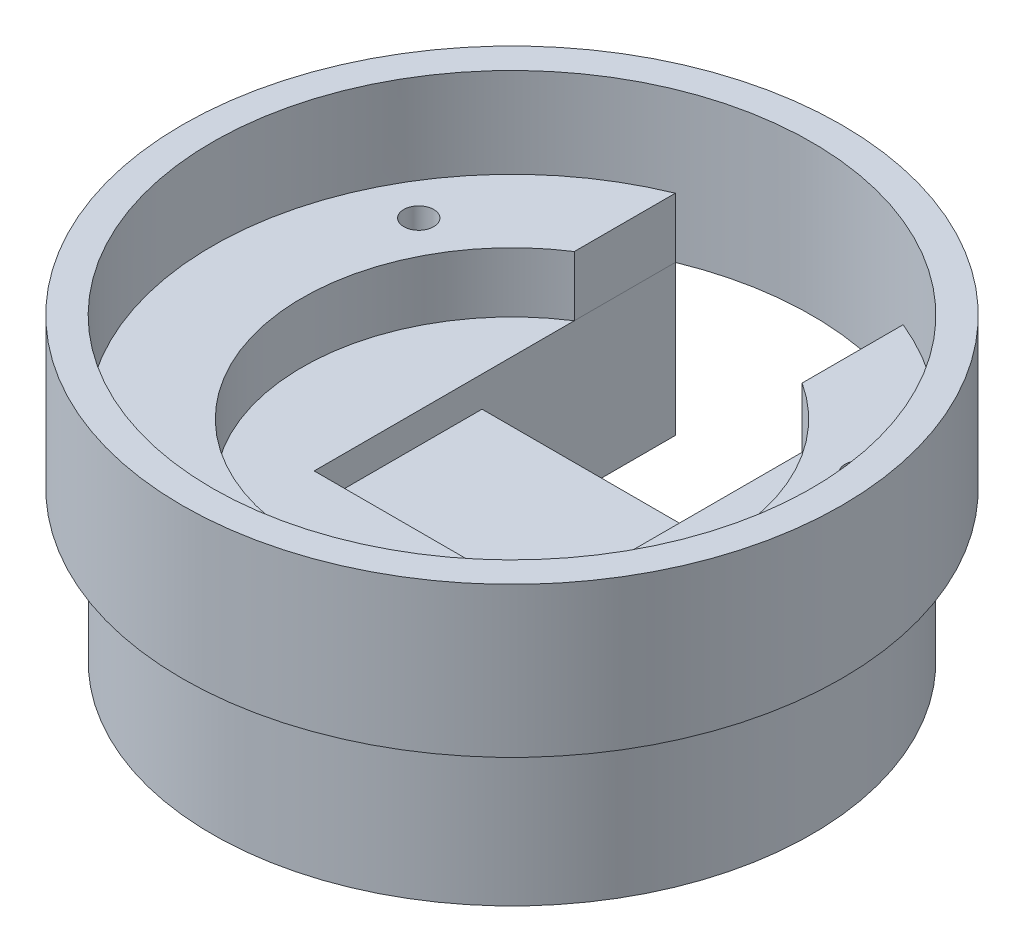
ISO-10303-21;
HEADER;
FILE_DESCRIPTION(('STEP AP214'),'2;1');
FILE_NAME('part.step','',(''),(''),'','','');
FILE_SCHEMA(('AUTOMOTIVE_DESIGN { 1 0 10303 214 1 1 1 1 }'));
ENDSEC;
DATA;
#1=APPLICATION_CONTEXT('core data for automotive mechanical design processes');
#2=APPLICATION_PROTOCOL_DEFINITION('international standard','automotive_design',2000,#1);
#3=PRODUCT_CONTEXT('',#1,'mechanical');
#4=PRODUCT('Part','Part','',(#3));
#5=PRODUCT_RELATED_PRODUCT_CATEGORY('part','',(#4));
#6=PRODUCT_DEFINITION_FORMATION('','',#4);
#7=PRODUCT_DEFINITION_CONTEXT('part definition',#1,'design');
#8=PRODUCT_DEFINITION('design','',#6,#7);
#9=PRODUCT_DEFINITION_SHAPE('','',#8);
#10=(LENGTH_UNIT() NAMED_UNIT(*) SI_UNIT(.MILLI.,.METRE.));
#11=(NAMED_UNIT(*) PLANE_ANGLE_UNIT() SI_UNIT($,.RADIAN.));
#12=(NAMED_UNIT(*) SI_UNIT($,.STERADIAN.) SOLID_ANGLE_UNIT());
#13=UNCERTAINTY_MEASURE_WITH_UNIT(LENGTH_MEASURE(1.E-05),#10,'distance_accuracy_value','');
#14=(GEOMETRIC_REPRESENTATION_CONTEXT(3) GLOBAL_UNCERTAINTY_ASSIGNED_CONTEXT((#13)) GLOBAL_UNIT_ASSIGNED_CONTEXT((#10,
#11,#12)) REPRESENTATION_CONTEXT('',''));
#15=CARTESIAN_POINT('',(0.,0.,0.));
#16=DIRECTION('',(0.,0.,1.));
#17=DIRECTION('',(1.,0.,0.));
#18=AXIS2_PLACEMENT_3D('',#15,#16,#17);
#19=CARTESIAN_POINT('',(0.,-12.5,0.));
#20=DIRECTION('',(0.,1.,0.));
#21=DIRECTION('',(0.,0.,1.));
#22=AXIS2_PLACEMENT_3D('',#19,#20,#21);
#23=CYLINDRICAL_SURFACE('',#22,25.);
#24=CARTESIAN_POINT('',(0.,0.,0.));
#25=DIRECTION('',(0.,-1.,0.));
#26=DIRECTION('',(0.,0.,-1.));
#27=AXIS2_PLACEMENT_3D('',#24,#25,#26);
#28=CIRCLE('',#27,25.);
#29=CARTESIAN_POINT('',(9.5,0.,-23.1246621596944));
#30=VERTEX_POINT('',#29);
#31=CARTESIAN_POINT('',(-9.5,0.,-23.1246621596944));
#32=VERTEX_POINT('',#31);
#33=EDGE_CURVE('E54',#30,#32,#28,.T.);
#34=ORIENTED_EDGE('',*,*,#33,.T.);
#35=DIRECTION('',(0.,1.,0.));
#36=VECTOR('',#35,1.);
#37=CARTESIAN_POINT('',(-9.5,-12.5,-23.1246621596944));
#38=LINE('',#37,#36);
#39=CARTESIAN_POINT('',(-9.5,-12.5,-23.1246621596944));
#40=VERTEX_POINT('',#39);
#41=EDGE_CURVE('E132',#32,#40,#38,.F.);
#42=ORIENTED_EDGE('',*,*,#41,.T.);
#43=CARTESIAN_POINT('',(0.,-12.5,0.));
#44=DIRECTION('',(0.,-1.,0.));
#45=DIRECTION('',(0.,0.,-1.));
#46=AXIS2_PLACEMENT_3D('',#43,#44,#45);
#47=CIRCLE('',#46,25.);
#48=CARTESIAN_POINT('',(9.5,-12.5,-23.1246621596944));
#49=VERTEX_POINT('',#48);
#50=EDGE_CURVE('E12',#49,#40,#47,.T.);
#51=ORIENTED_EDGE('',*,*,#50,.F.);
#52=DIRECTION('',(0.,1.,0.));
#53=VECTOR('',#52,1.);
#54=CARTESIAN_POINT('',(9.5,-12.5,-23.1246621596944));
#55=LINE('',#54,#53);
#56=EDGE_CURVE('E112',#49,#30,#55,.T.);
#57=ORIENTED_EDGE('',*,*,#56,.T.);
#58=EDGE_LOOP('',(#34,#42,#51,#57));
#59=FACE_BOUND('',#58,.T.);
#60=ADVANCED_FACE('F46',(#59),#23,.T.);
#61=CARTESIAN_POINT('',(0.,-12.5,0.));
#62=DIRECTION('',(0.,-1.,0.));
#63=DIRECTION('',(0.,0.,-1.));
#64=AXIS2_PLACEMENT_3D('',#61,#62,#63);
#65=PLANE('',#64);
#66=CARTESIAN_POINT('',(18.4030398304193,-12.5,-10.6250000000001));
#67=DIRECTION('',(0.,-1.,0.));
#68=DIRECTION('',(0.,0.,-1.));
#69=AXIS2_PLACEMENT_3D('',#66,#67,#68);
#70=CIRCLE('',#69,1.25);
#71=CARTESIAN_POINT('',(18.4030398304193,-12.5,-11.8750000000001));
#72=VERTEX_POINT('',#71);
#73=EDGE_CURVE('E167',#72,#72,#70,.F.);
#74=ORIENTED_EDGE('',*,*,#73,.T.);
#75=EDGE_LOOP('',(#74));
#76=FACE_BOUND('',#75,.T.);
#77=CARTESIAN_POINT('',(0.,-12.5,21.25));
#78=DIRECTION('',(0.,-1.,0.));
#79=DIRECTION('',(0.,0.,-1.));
#80=AXIS2_PLACEMENT_3D('',#77,#78,#79);
#81=CIRCLE('',#80,1.25);
#82=CARTESIAN_POINT('',(0.,-12.5,20.));
#83=VERTEX_POINT('',#82);
#84=EDGE_CURVE('E158',#83,#83,#81,.F.);
#85=ORIENTED_EDGE('',*,*,#84,.T.);
#86=EDGE_LOOP('',(#85));
#87=FACE_BOUND('',#86,.T.);
#88=CARTESIAN_POINT('',(-18.4030398304193,-12.5,-10.6250000000001));
#89=DIRECTION('',(0.,-1.,0.));
#90=DIRECTION('',(0.,0.,-1.));
#91=AXIS2_PLACEMENT_3D('',#88,#89,#90);
#92=CIRCLE('',#91,1.25);
#93=CARTESIAN_POINT('',(-18.4030398304193,-12.5,-11.8750000000001));
#94=VERTEX_POINT('',#93);
#95=EDGE_CURVE('E155',#94,#94,#92,.F.);
#96=ORIENTED_EDGE('',*,*,#95,.T.);
#97=EDGE_LOOP('',(#96));
#98=FACE_BOUND('',#97,.T.);
#99=DIRECTION('',(0.,0.,1.));
#100=VECTOR('',#99,1.);
#101=CARTESIAN_POINT('',(-9.5,-12.5,-7.));
#102=LINE('',#101,#100);
#103=CARTESIAN_POINT('',(-9.5,-12.5,-7.));
#104=VERTEX_POINT('',#103);
#105=EDGE_CURVE('E124',#40,#104,#102,.T.);
#106=ORIENTED_EDGE('',*,*,#105,.T.);
#107=DIRECTION('',(1.,0.,0.));
#108=VECTOR('',#107,1.);
#109=CARTESIAN_POINT('',(9.5,-12.5,-7.));
#110=LINE('',#109,#108);
#111=CARTESIAN_POINT('',(9.5,-12.5,-7.));
#112=VERTEX_POINT('',#111);
#113=EDGE_CURVE('E118',#104,#112,#110,.T.);
#114=ORIENTED_EDGE('',*,*,#113,.T.);
#115=DIRECTION('',(0.,0.,-1.));
#116=VECTOR('',#115,1.);
#117=CARTESIAN_POINT('',(9.5,-12.5,-7.));
#118=LINE('',#117,#116);
#119=EDGE_CURVE('E106',#112,#49,#118,.T.);
#120=ORIENTED_EDGE('',*,*,#119,.T.);
#121=ORIENTED_EDGE('',*,*,#50,.T.);
#122=EDGE_LOOP('',(#106,#114,#120,#121));
#123=FACE_BOUND('',#122,.T.);
#124=ADVANCED_FACE('F123',(#76,#87,#98,#123),#65,.T.);
#125=CARTESIAN_POINT('',(0.,0.,0.));
#126=DIRECTION('',(0.,-1.,0.));
#127=DIRECTION('',(0.,0.,-1.));
#128=AXIS2_PLACEMENT_3D('',#125,#126,#127);
#129=PLANE('',#128);
#130=CARTESIAN_POINT('',(18.4030398304193,0.,-10.6250000000001));
#131=DIRECTION('',(0.,-1.,0.));
#132=DIRECTION('',(0.,0.,-1.));
#133=AXIS2_PLACEMENT_3D('',#130,#131,#132);
#134=CIRCLE('',#133,1.25);
#135=CARTESIAN_POINT('',(18.4030398304193,0.,-11.8750000000001));
#136=VERTEX_POINT('',#135);
#137=EDGE_CURVE('E49',#136,#136,#134,.T.);
#138=ORIENTED_EDGE('',*,*,#137,.T.);
#139=EDGE_LOOP('',(#138));
#140=FACE_BOUND('',#139,.T.);
#141=CARTESIAN_POINT('',(0.,0.,21.25));
#142=DIRECTION('',(0.,-1.,0.));
#143=DIRECTION('',(0.,0.,-1.));
#144=AXIS2_PLACEMENT_3D('',#141,#142,#143);
#145=CIRCLE('',#144,1.25);
#146=CARTESIAN_POINT('',(0.,0.,20.));
#147=VERTEX_POINT('',#146);
#148=EDGE_CURVE('E156',#147,#147,#145,.T.);
#149=ORIENTED_EDGE('',*,*,#148,.T.);
#150=EDGE_LOOP('',(#149));
#151=FACE_BOUND('',#150,.T.);
#152=CARTESIAN_POINT('',(-18.4030398304193,0.,-10.6250000000001));
#153=DIRECTION('',(0.,-1.,0.));
#154=DIRECTION('',(0.,0.,-1.));
#155=AXIS2_PLACEMENT_3D('',#152,#153,#154);
#156=CIRCLE('',#155,1.25);
#157=CARTESIAN_POINT('',(-18.4030398304193,0.,-11.8750000000001));
#158=VERTEX_POINT('',#157);
#159=EDGE_CURVE('E129',#158,#158,#156,.T.);
#160=ORIENTED_EDGE('',*,*,#159,.T.);
#161=EDGE_LOOP('',(#160));
#162=FACE_BOUND('',#161,.T.);
#163=DIRECTION('',(0.,0.,1.));
#164=VECTOR('',#163,1.);
#165=CARTESIAN_POINT('',(-9.5,0.,-7.));
#166=LINE('',#165,#164);
#167=CARTESIAN_POINT('',(-9.5,0.,7.));
#168=VERTEX_POINT('',#167);
#169=EDGE_CURVE('E62',#32,#168,#166,.T.);
#170=ORIENTED_EDGE('',*,*,#169,.F.);
#171=ORIENTED_EDGE('',*,*,#33,.F.);
#172=DIRECTION('',(0.,0.,-1.));
#173=VECTOR('',#172,1.);
#174=CARTESIAN_POINT('',(9.5,0.,-7.));
#175=LINE('',#174,#173);
#176=CARTESIAN_POINT('',(9.5,0.,7.));
#177=VERTEX_POINT('',#176);
#178=EDGE_CURVE('E139',#177,#30,#175,.T.);
#179=ORIENTED_EDGE('',*,*,#178,.F.);
#180=DIRECTION('',(1.,0.,0.));
#181=VECTOR('',#180,1.);
#182=CARTESIAN_POINT('',(9.5,0.,7.));
#183=LINE('',#182,#181);
#184=EDGE_CURVE('E147',#168,#177,#183,.T.);
#185=ORIENTED_EDGE('',*,*,#184,.F.);
#186=EDGE_LOOP('',(#170,#171,#179,#185));
#187=FACE_BOUND('',#186,.T.);
#188=ADVANCED_FACE('F180',(#140,#151,#162,#187),#129,.F.);
#189=CARTESIAN_POINT('',(-9.5,-2.54,-7.));
#190=DIRECTION('',(-1.,0.,0.));
#191=DIRECTION('',(0.,0.,1.));
#192=AXIS2_PLACEMENT_3D('',#189,#190,#191);
#193=PLANE('',#192);
#194=ORIENTED_EDGE('',*,*,#169,.T.);
#195=DIRECTION('',(0.,1.,0.));
#196=VECTOR('',#195,1.);
#197=CARTESIAN_POINT('',(-9.5,-2.54,7.));
#198=LINE('',#197,#196);
#199=CARTESIAN_POINT('',(-9.5,-2.54,7.));
#200=VERTEX_POINT('',#199);
#201=EDGE_CURVE('E145',#200,#168,#198,.T.);
#202=ORIENTED_EDGE('',*,*,#201,.F.);
#203=DIRECTION('',(0.,0.,1.));
#204=VECTOR('',#203,1.);
#205=CARTESIAN_POINT('',(-9.5,-2.54,-7.));
#206=LINE('',#205,#204);
#207=CARTESIAN_POINT('',(-9.5,-2.54,-7.));
#208=VERTEX_POINT('',#207);
#209=EDGE_CURVE('E135',#208,#200,#206,.T.);
#210=ORIENTED_EDGE('',*,*,#209,.F.);
#211=DIRECTION('',(0.,1.,0.));
#212=VECTOR('',#211,1.);
#213=CARTESIAN_POINT('',(-9.5,-40.4508497187474,-7.));
#214=LINE('',#213,#212);
#215=EDGE_CURVE('E71',#104,#208,#214,.T.);
#216=ORIENTED_EDGE('',*,*,#215,.F.);
#217=ORIENTED_EDGE('',*,*,#105,.F.);
#218=ORIENTED_EDGE('',*,*,#41,.F.);
#219=EDGE_LOOP('',(#194,#202,#210,#216,#217,#218));
#220=FACE_BOUND('',#219,.T.);
#221=ADVANCED_FACE('F182',(#220),#193,.F.);
#222=CARTESIAN_POINT('',(9.5,-2.54,-7.));
#223=DIRECTION('',(1.,0.,0.));
#224=DIRECTION('',(0.,0.,-1.));
#225=AXIS2_PLACEMENT_3D('',#222,#223,#224);
#226=PLANE('',#225);
#227=ORIENTED_EDGE('',*,*,#178,.T.);
#228=ORIENTED_EDGE('',*,*,#56,.F.);
#229=ORIENTED_EDGE('',*,*,#119,.F.);
#230=DIRECTION('',(0.,1.,0.));
#231=VECTOR('',#230,1.);
#232=CARTESIAN_POINT('',(9.5,-40.4508497187474,-7.));
#233=LINE('',#232,#231);
#234=CARTESIAN_POINT('',(9.5,-2.54,-7.));
#235=VERTEX_POINT('',#234);
#236=EDGE_CURVE('E109',#112,#235,#233,.T.);
#237=ORIENTED_EDGE('',*,*,#236,.T.);
#238=DIRECTION('',(0.,0.,-1.));
#239=VECTOR('',#238,1.);
#240=CARTESIAN_POINT('',(9.5,-2.54,-7.));
#241=LINE('',#240,#239);
#242=CARTESIAN_POINT('',(9.5,-2.54,7.));
#243=VERTEX_POINT('',#242);
#244=EDGE_CURVE('E142',#243,#235,#241,.T.);
#245=ORIENTED_EDGE('',*,*,#244,.F.);
#246=DIRECTION('',(0.,1.,0.));
#247=VECTOR('',#246,1.);
#248=CARTESIAN_POINT('',(9.5,-2.54,7.));
#249=LINE('',#248,#247);
#250=EDGE_CURVE('E83',#243,#177,#249,.T.);
#251=ORIENTED_EDGE('',*,*,#250,.T.);
#252=EDGE_LOOP('',(#227,#228,#229,#237,#245,#251));
#253=FACE_BOUND('',#252,.T.);
#254=ADVANCED_FACE('F108',(#253),#226,.F.);
#255=CARTESIAN_POINT('',(9.5,-2.54,7.));
#256=DIRECTION('',(0.,0.,1.));
#257=DIRECTION('',(1.,0.,0.));
#258=AXIS2_PLACEMENT_3D('',#255,#256,#257);
#259=PLANE('',#258);
#260=ORIENTED_EDGE('',*,*,#184,.T.);
#261=ORIENTED_EDGE('',*,*,#250,.F.);
#262=DIRECTION('',(1.,0.,0.));
#263=VECTOR('',#262,1.);
#264=CARTESIAN_POINT('',(9.5,-2.54,7.));
#265=LINE('',#264,#263);
#266=EDGE_CURVE('E138',#200,#243,#265,.T.);
#267=ORIENTED_EDGE('',*,*,#266,.F.);
#268=ORIENTED_EDGE('',*,*,#201,.T.);
#269=EDGE_LOOP('',(#260,#261,#267,#268));
#270=FACE_BOUND('',#269,.T.);
#271=ADVANCED_FACE('F207',(#270),#259,.F.);
#272=CARTESIAN_POINT('',(0.,-2.54,0.));
#273=DIRECTION('',(0.,-1.,0.));
#274=DIRECTION('',(0.,0.,-1.));
#275=AXIS2_PLACEMENT_3D('',#272,#273,#274);
#276=PLANE('',#275);
#277=ORIENTED_EDGE('',*,*,#209,.T.);
#278=ORIENTED_EDGE('',*,*,#266,.T.);
#279=ORIENTED_EDGE('',*,*,#244,.T.);
#280=DIRECTION('',(-1.,0.,0.));
#281=VECTOR('',#280,1.);
#282=CARTESIAN_POINT('',(9.5,-2.54,-7.));
#283=LINE('',#282,#281);
#284=EDGE_CURVE('E120',#235,#208,#283,.T.);
#285=ORIENTED_EDGE('',*,*,#284,.T.);
#286=EDGE_LOOP('',(#277,#278,#279,#285));
#287=FACE_BOUND('',#286,.T.);
#288=ADVANCED_FACE('F196',(#287),#276,.F.);
#289=CARTESIAN_POINT('',(9.5,-40.4508497187474,-7.));
#290=DIRECTION('',(0.,0.,1.));
#291=DIRECTION('',(1.,0.,0.));
#292=AXIS2_PLACEMENT_3D('',#289,#290,#291);
#293=PLANE('',#292);
#294=ORIENTED_EDGE('',*,*,#236,.F.);
#295=ORIENTED_EDGE('',*,*,#113,.F.);
#296=ORIENTED_EDGE('',*,*,#215,.T.);
#297=ORIENTED_EDGE('',*,*,#284,.F.);
#298=EDGE_LOOP('',(#294,#295,#296,#297));
#299=FACE_BOUND('',#298,.T.);
#300=ADVANCED_FACE('F117',(#299),#293,.F.);
#301=CARTESIAN_POINT('',(-18.4030398304193,5.,-10.6250000000001));
#302=DIRECTION('',(0.,1.,0.));
#303=DIRECTION('',(0.,0.,1.));
#304=AXIS2_PLACEMENT_3D('',#301,#302,#303);
#305=CYLINDRICAL_SURFACE('',#304,1.25);
#306=ORIENTED_EDGE('',*,*,#95,.F.);
#307=EDGE_LOOP('',(#306));
#308=FACE_BOUND('',#307,.T.);
#309=ORIENTED_EDGE('',*,*,#159,.F.);
#310=EDGE_LOOP('',(#309));
#311=FACE_BOUND('',#310,.T.);
#312=ADVANCED_FACE('F186',(#308,#311),#305,.F.);
#313=CARTESIAN_POINT('',(0.,5.,21.25));
#314=DIRECTION('',(0.,1.,0.));
#315=DIRECTION('',(0.,0.,1.));
#316=AXIS2_PLACEMENT_3D('',#313,#314,#315);
#317=CYLINDRICAL_SURFACE('',#316,1.25);
#318=ORIENTED_EDGE('',*,*,#84,.F.);
#319=EDGE_LOOP('',(#318));
#320=FACE_BOUND('',#319,.T.);
#321=ORIENTED_EDGE('',*,*,#148,.F.);
#322=EDGE_LOOP('',(#321));
#323=FACE_BOUND('',#322,.T.);
#324=ADVANCED_FACE('F176',(#320,#323),#317,.F.);
#325=CARTESIAN_POINT('',(18.4030398304193,5.,-10.6250000000001));
#326=DIRECTION('',(0.,1.,0.));
#327=DIRECTION('',(0.,0.,1.));
#328=AXIS2_PLACEMENT_3D('',#325,#326,#327);
#329=CYLINDRICAL_SURFACE('',#328,1.25);
#330=ORIENTED_EDGE('',*,*,#73,.F.);
#331=EDGE_LOOP('',(#330));
#332=FACE_BOUND('',#331,.T.);
#333=ORIENTED_EDGE('',*,*,#137,.F.);
#334=EDGE_LOOP('',(#333));
#335=FACE_BOUND('',#334,.T.);
#336=ADVANCED_FACE('F173',(#332,#335),#329,.F.);
#337=CLOSED_SHELL('',(#60,#124,#188,#221,#254,#271,#288,#300,#312,#324,#336));
#338=MANIFOLD_SOLID_BREP('B2',#337);
#339=CARTESIAN_POINT('',(0.,0.,0.));
#340=DIRECTION('',(0.,1.,0.));
#341=DIRECTION('',(0.,0.,1.));
#342=AXIS2_PLACEMENT_3D('',#339,#340,#341);
#343=PLANE('',#342);
#344=CARTESIAN_POINT('',(18.4030398304193,0.,-10.6250000000001));
#345=DIRECTION('',(0.,1.,0.));
#346=DIRECTION('',(0.,0.,1.));
#347=AXIS2_PLACEMENT_3D('',#344,#345,#346);
#348=CIRCLE('',#347,1.25);
#349=CARTESIAN_POINT('',(18.4030398304193,0.,-9.3750000000001));
#350=VERTEX_POINT('',#349);
#351=EDGE_CURVE('E476',#350,#350,#348,.T.);
#352=ORIENTED_EDGE('',*,*,#351,.T.);
#353=EDGE_LOOP('',(#352));
#354=FACE_BOUND('',#353,.T.);
#355=CARTESIAN_POINT('',(0.,0.,21.25));
#356=DIRECTION('',(0.,1.,0.));
#357=DIRECTION('',(0.,0.,1.));
#358=AXIS2_PLACEMENT_3D('',#355,#356,#357);
#359=CIRCLE('',#358,1.25);
#360=CARTESIAN_POINT('',(0.,0.,22.5));
#361=VERTEX_POINT('',#360);
#362=EDGE_CURVE('E480',#361,#361,#359,.T.);
#363=ORIENTED_EDGE('',*,*,#362,.T.);
#364=EDGE_LOOP('',(#363));
#365=FACE_BOUND('',#364,.T.);
#366=CARTESIAN_POINT('',(-18.4030398304193,0.,-10.6250000000001));
#367=DIRECTION('',(0.,1.,0.));
#368=DIRECTION('',(0.,0.,1.));
#369=AXIS2_PLACEMENT_3D('',#366,#367,#368);
#370=CIRCLE('',#369,1.25);
#371=CARTESIAN_POINT('',(-18.4030398304193,0.,-9.37500000000009));
#372=VERTEX_POINT('',#371);
#373=EDGE_CURVE('E339',#372,#372,#370,.T.);
#374=ORIENTED_EDGE('',*,*,#373,.T.);
#375=EDGE_LOOP('',(#374));
#376=FACE_BOUND('',#375,.T.);
#377=CARTESIAN_POINT('',(0.,0.,0.));
#378=DIRECTION('',(0.,1.,0.));
#379=DIRECTION('',(0.,0.,1.));
#380=AXIS2_PLACEMENT_3D('',#377,#378,#379);
#381=CIRCLE('',#380,27.5);
#382=CARTESIAN_POINT('',(0.,0.,27.5));
#383=VERTEX_POINT('',#382);
#384=EDGE_CURVE('E356',#383,#383,#381,.T.);
#385=ORIENTED_EDGE('',*,*,#384,.F.);
#386=EDGE_LOOP('',(#385));
#387=FACE_BOUND('',#386,.T.);
#388=DIRECTION('',(0.,0.,1.));
#389=VECTOR('',#388,1.);
#390=CARTESIAN_POINT('',(-9.5,0.,-14.6969384566991));
#391=LINE('',#390,#389);
#392=CARTESIAN_POINT('',(-9.5,0.,-23.1246621596944));
#393=VERTEX_POINT('',#392);
#394=CARTESIAN_POINT('',(-9.5,0.,-14.6969384566991));
#395=VERTEX_POINT('',#394);
#396=EDGE_CURVE('E313',#393,#395,#391,.T.);
#397=ORIENTED_EDGE('',*,*,#396,.T.);
#398=CARTESIAN_POINT('',(0.,0.,0.));
#399=DIRECTION('',(0.,1.,0.));
#400=DIRECTION('',(0.,0.,1.));
#401=AXIS2_PLACEMENT_3D('',#398,#399,#400);
#402=CIRCLE('',#401,17.5);
#403=CARTESIAN_POINT('',(9.5,0.,-14.6969384566991));
#404=VERTEX_POINT('',#403);
#405=EDGE_CURVE('E347',#395,#404,#402,.T.);
#406=ORIENTED_EDGE('',*,*,#405,.T.);
#407=DIRECTION('',(0.,0.,1.));
#408=VECTOR('',#407,1.);
#409=CARTESIAN_POINT('',(9.5,0.,-14.6969384566991));
#410=LINE('',#409,#408);
#411=CARTESIAN_POINT('',(9.5,0.,-23.1246621596944));
#412=VERTEX_POINT('',#411);
#413=EDGE_CURVE('E305',#412,#404,#410,.T.);
#414=ORIENTED_EDGE('',*,*,#413,.F.);
#415=CARTESIAN_POINT('',(0.,0.,0.));
#416=DIRECTION('',(0.,1.,0.));
#417=DIRECTION('',(0.,0.,1.));
#418=AXIS2_PLACEMENT_3D('',#415,#416,#417);
#419=CIRCLE('',#418,25.);
#420=EDGE_CURVE('E348',#393,#412,#419,.F.);
#421=ORIENTED_EDGE('',*,*,#420,.F.);
#422=EDGE_LOOP('',(#397,#406,#414,#421));
#423=FACE_BOUND('',#422,.T.);
#424=ADVANCED_FACE('F290',(#354,#365,#376,#387,#423),#343,.F.);
#425=CARTESIAN_POINT('',(0.,5.,0.));
#426=DIRECTION('',(0.,1.,0.));
#427=DIRECTION('',(0.,0.,1.));
#428=AXIS2_PLACEMENT_3D('',#425,#426,#427);
#429=PLANE('',#428);
#430=CARTESIAN_POINT('',(18.4030398304193,5.,-10.6250000000001));
#431=DIRECTION('',(0.,1.,0.));
#432=DIRECTION('',(0.,0.,1.));
#433=AXIS2_PLACEMENT_3D('',#430,#431,#432);
#434=CIRCLE('',#433,1.25);
#435=CARTESIAN_POINT('',(18.4030398304193,5.,-9.3750000000001));
#436=VERTEX_POINT('',#435);
#437=EDGE_CURVE('E473',#436,#436,#434,.T.);
#438=ORIENTED_EDGE('',*,*,#437,.F.);
#439=EDGE_LOOP('',(#438));
#440=FACE_BOUND('',#439,.T.);
#441=CARTESIAN_POINT('',(0.,5.,21.25));
#442=DIRECTION('',(0.,1.,0.));
#443=DIRECTION('',(0.,0.,1.));
#444=AXIS2_PLACEMENT_3D('',#441,#442,#443);
#445=CIRCLE('',#444,1.25);
#446=CARTESIAN_POINT('',(0.,5.,22.5));
#447=VERTEX_POINT('',#446);
#448=EDGE_CURVE('E477',#447,#447,#445,.T.);
#449=ORIENTED_EDGE('',*,*,#448,.F.);
#450=EDGE_LOOP('',(#449));
#451=FACE_BOUND('',#450,.T.);
#452=CARTESIAN_POINT('',(-18.4030398304193,5.,-10.6250000000001));
#453=DIRECTION('',(0.,1.,0.));
#454=DIRECTION('',(0.,0.,1.));
#455=AXIS2_PLACEMENT_3D('',#452,#453,#454);
#456=CIRCLE('',#455,1.25);
#457=CARTESIAN_POINT('',(-18.4030398304193,5.,-9.37500000000009));
#458=VERTEX_POINT('',#457);
#459=EDGE_CURVE('E486',#458,#458,#456,.T.);
#460=ORIENTED_EDGE('',*,*,#459,.F.);
#461=EDGE_LOOP('',(#460));
#462=FACE_BOUND('',#461,.T.);
#463=CARTESIAN_POINT('',(0.,5.,0.));
#464=DIRECTION('',(0.,1.,0.));
#465=DIRECTION('',(0.,0.,1.));
#466=AXIS2_PLACEMENT_3D('',#463,#464,#465);
#467=CIRCLE('',#466,17.5);
#468=CARTESIAN_POINT('',(-9.5,5.,-14.6969384566991));
#469=VERTEX_POINT('',#468);
#470=CARTESIAN_POINT('',(9.5,5.,-14.6969384566991));
#471=VERTEX_POINT('',#470);
#472=EDGE_CURVE('E345',#469,#471,#467,.T.);
#473=ORIENTED_EDGE('',*,*,#472,.F.);
#474=DIRECTION('',(0.,0.,-1.));
#475=VECTOR('',#474,1.);
#476=CARTESIAN_POINT('',(-9.5,5.,-14.6969384566991));
#477=LINE('',#476,#475);
#478=CARTESIAN_POINT('',(-9.5,5.,-23.1246621596944));
#479=VERTEX_POINT('',#478);
#480=EDGE_CURVE('E330',#469,#479,#477,.T.);
#481=ORIENTED_EDGE('',*,*,#480,.T.);
#482=CARTESIAN_POINT('',(0.,5.,0.));
#483=DIRECTION('',(0.,1.,0.));
#484=DIRECTION('',(0.,0.,1.));
#485=AXIS2_PLACEMENT_3D('',#482,#483,#484);
#486=CIRCLE('',#485,25.);
#487=CARTESIAN_POINT('',(9.5,5.,-23.1246621596944));
#488=VERTEX_POINT('',#487);
#489=EDGE_CURVE('E44',#479,#488,#486,.T.);
#490=ORIENTED_EDGE('',*,*,#489,.T.);
#491=DIRECTION('',(0.,0.,-1.));
#492=VECTOR('',#491,1.);
#493=CARTESIAN_POINT('',(9.5,5.,-14.6969384566991));
#494=LINE('',#493,#492);
#495=EDGE_CURVE('E338',#471,#488,#494,.T.);
#496=ORIENTED_EDGE('',*,*,#495,.F.);
#497=EDGE_LOOP('',(#473,#481,#490,#496));
#498=FACE_BOUND('',#497,.T.);
#499=ADVANCED_FACE('F351',(#440,#451,#462,#498),#429,.T.);
#500=CARTESIAN_POINT('',(0.,5.,0.));
#501=DIRECTION('',(0.,-1.,0.));
#502=DIRECTION('',(0.,0.,-1.));
#503=AXIS2_PLACEMENT_3D('',#500,#501,#502);
#504=CYLINDRICAL_SURFACE('',#503,17.5);
#505=ORIENTED_EDGE('',*,*,#405,.F.);
#506=DIRECTION('',(0.,1.,0.));
#507=VECTOR('',#506,1.);
#508=CARTESIAN_POINT('',(-9.5,-21.6137242779917,-14.6969384566991));
#509=LINE('',#508,#507);
#510=EDGE_CURVE('E333',#395,#469,#509,.T.);
#511=ORIENTED_EDGE('',*,*,#510,.T.);
#512=ORIENTED_EDGE('',*,*,#472,.T.);
#513=DIRECTION('',(0.,1.,0.));
#514=VECTOR('',#513,1.);
#515=CARTESIAN_POINT('',(9.5,-21.6137242779917,-14.6969384566991));
#516=LINE('',#515,#514);
#517=EDGE_CURVE('E375',#404,#471,#516,.T.);
#518=ORIENTED_EDGE('',*,*,#517,.F.);
#519=EDGE_LOOP('',(#505,#511,#512,#518));
#520=FACE_BOUND('',#519,.T.);
#521=ADVANCED_FACE('F344',(#520),#504,.F.);
#522=CARTESIAN_POINT('',(0.,12.5,0.));
#523=DIRECTION('',(0.,1.,0.));
#524=DIRECTION('',(0.,0.,1.));
#525=AXIS2_PLACEMENT_3D('',#522,#523,#524);
#526=PLANE('',#525);
#527=CARTESIAN_POINT('',(0.,12.5,0.));
#528=DIRECTION('',(0.,1.,0.));
#529=DIRECTION('',(0.,0.,1.));
#530=AXIS2_PLACEMENT_3D('',#527,#528,#529);
#531=CIRCLE('',#530,27.5);
#532=CARTESIAN_POINT('',(0.,12.5,27.5));
#533=VERTEX_POINT('',#532);
#534=EDGE_CURVE('E298',#533,#533,#531,.T.);
#535=ORIENTED_EDGE('',*,*,#534,.T.);
#536=EDGE_LOOP('',(#535));
#537=FACE_BOUND('',#536,.T.);
#538=CARTESIAN_POINT('',(0.,12.5,0.));
#539=DIRECTION('',(0.,1.,0.));
#540=DIRECTION('',(0.,0.,1.));
#541=AXIS2_PLACEMENT_3D('',#538,#539,#540);
#542=CIRCLE('',#541,25.);
#543=CARTESIAN_POINT('',(0.,12.5,25.));
#544=VERTEX_POINT('',#543);
#545=EDGE_CURVE('E353',#544,#544,#542,.T.);
#546=ORIENTED_EDGE('',*,*,#545,.F.);
#547=EDGE_LOOP('',(#546));
#548=FACE_BOUND('',#547,.T.);
#549=ADVANCED_FACE('F398',(#537,#548),#526,.T.);
#550=CARTESIAN_POINT('',(0.,12.5,0.));
#551=DIRECTION('',(0.,-1.,0.));
#552=DIRECTION('',(0.,0.,-1.));
#553=AXIS2_PLACEMENT_3D('',#550,#551,#552);
#554=CYLINDRICAL_SURFACE('',#553,27.5);
#555=ORIENTED_EDGE('',*,*,#534,.F.);
#556=EDGE_LOOP('',(#555));
#557=FACE_BOUND('',#556,.T.);
#558=ORIENTED_EDGE('',*,*,#384,.T.);
#559=EDGE_LOOP('',(#558));
#560=FACE_BOUND('',#559,.T.);
#561=ADVANCED_FACE('F292',(#557,#560),#554,.T.);
#562=CARTESIAN_POINT('',(0.,12.5,0.));
#563=DIRECTION('',(0.,-1.,0.));
#564=DIRECTION('',(0.,0.,-1.));
#565=AXIS2_PLACEMENT_3D('',#562,#563,#564);
#566=CYLINDRICAL_SURFACE('',#565,25.);
#567=ORIENTED_EDGE('',*,*,#489,.F.);
#568=DIRECTION('',(0.,1.,0.));
#569=VECTOR('',#568,1.);
#570=CARTESIAN_POINT('',(-9.5,-21.6137242779917,-23.1246621596944));
#571=LINE('',#570,#569);
#572=EDGE_CURVE('E334',#393,#479,#571,.T.);
#573=ORIENTED_EDGE('',*,*,#572,.F.);
#574=ORIENTED_EDGE('',*,*,#420,.T.);
#575=DIRECTION('',(0.,1.,0.));
#576=VECTOR('',#575,1.);
#577=CARTESIAN_POINT('',(9.5,-21.6137242779917,-23.1246621596944));
#578=LINE('',#577,#576);
#579=EDGE_CURVE('E377',#412,#488,#578,.T.);
#580=ORIENTED_EDGE('',*,*,#579,.T.);
#581=EDGE_LOOP('',(#567,#573,#574,#580));
#582=FACE_BOUND('',#581,.T.);
#583=ORIENTED_EDGE('',*,*,#545,.T.);
#584=EDGE_LOOP('',(#583));
#585=FACE_BOUND('',#584,.T.);
#586=ADVANCED_FACE('F380',(#582,#585),#566,.F.);
#587=CARTESIAN_POINT('',(-9.5,-21.6137242779917,-14.6969384566991));
#588=DIRECTION('',(1.,0.,0.));
#589=DIRECTION('',(0.,0.,-1.));
#590=AXIS2_PLACEMENT_3D('',#587,#588,#589);
#591=PLANE('',#590);
#592=ORIENTED_EDGE('',*,*,#572,.T.);
#593=ORIENTED_EDGE('',*,*,#480,.F.);
#594=ORIENTED_EDGE('',*,*,#510,.F.);
#595=ORIENTED_EDGE('',*,*,#396,.F.);
#596=EDGE_LOOP('',(#592,#593,#594,#595));
#597=FACE_BOUND('',#596,.T.);
#598=ADVANCED_FACE('F332',(#597),#591,.T.);
#599=CARTESIAN_POINT('',(9.5,-21.6137242779917,-14.6969384566991));
#600=DIRECTION('',(1.,0.,0.));
#601=DIRECTION('',(0.,0.,-1.));
#602=AXIS2_PLACEMENT_3D('',#599,#600,#601);
#603=PLANE('',#602);
#604=ORIENTED_EDGE('',*,*,#413,.T.);
#605=ORIENTED_EDGE('',*,*,#517,.T.);
#606=ORIENTED_EDGE('',*,*,#495,.T.);
#607=ORIENTED_EDGE('',*,*,#579,.F.);
#608=EDGE_LOOP('',(#604,#605,#606,#607));
#609=FACE_BOUND('',#608,.T.);
#610=ADVANCED_FACE('F382',(#609),#603,.F.);
#611=CARTESIAN_POINT('',(-18.4030398304193,5.,-10.6250000000001));
#612=DIRECTION('',(0.,1.,0.));
#613=DIRECTION('',(0.,0.,1.));
#614=AXIS2_PLACEMENT_3D('',#611,#612,#613);
#615=CYLINDRICAL_SURFACE('',#614,1.25);
#616=ORIENTED_EDGE('',*,*,#459,.T.);
#617=EDGE_LOOP('',(#616));
#618=FACE_BOUND('',#617,.T.);
#619=ORIENTED_EDGE('',*,*,#373,.F.);
#620=EDGE_LOOP('',(#619));
#621=FACE_BOUND('',#620,.T.);
#622=ADVANCED_FACE('F384',(#618,#621),#615,.F.);
#623=CARTESIAN_POINT('',(0.,5.,21.25));
#624=DIRECTION('',(0.,1.,0.));
#625=DIRECTION('',(0.,0.,1.));
#626=AXIS2_PLACEMENT_3D('',#623,#624,#625);
#627=CYLINDRICAL_SURFACE('',#626,1.25);
#628=ORIENTED_EDGE('',*,*,#448,.T.);
#629=EDGE_LOOP('',(#628));
#630=FACE_BOUND('',#629,.T.);
#631=ORIENTED_EDGE('',*,*,#362,.F.);
#632=EDGE_LOOP('',(#631));
#633=FACE_BOUND('',#632,.T.);
#634=ADVANCED_FACE('F390',(#630,#633),#627,.F.);
#635=CARTESIAN_POINT('',(18.4030398304193,5.,-10.6250000000001));
#636=DIRECTION('',(0.,1.,0.));
#637=DIRECTION('',(0.,0.,1.));
#638=AXIS2_PLACEMENT_3D('',#635,#636,#637);
#639=CYLINDRICAL_SURFACE('',#638,1.25);
#640=ORIENTED_EDGE('',*,*,#437,.T.);
#641=EDGE_LOOP('',(#640));
#642=FACE_BOUND('',#641,.T.);
#643=ORIENTED_EDGE('',*,*,#351,.F.);
#644=EDGE_LOOP('',(#643));
#645=FACE_BOUND('',#644,.T.);
#646=ADVANCED_FACE('F457',(#642,#645),#639,.F.);
#647=CLOSED_SHELL('',(#424,#499,#521,#549,#561,#586,#598,#610,#622,#634,#646));
#648=MANIFOLD_SOLID_BREP('B6',#647);
#649=ADVANCED_BREP_SHAPE_REPRESENTATION('',(#18,#338,#648),#14);
#650=SHAPE_DEFINITION_REPRESENTATION(#9,#649);
ENDSEC;
END-ISO-10303-21;
